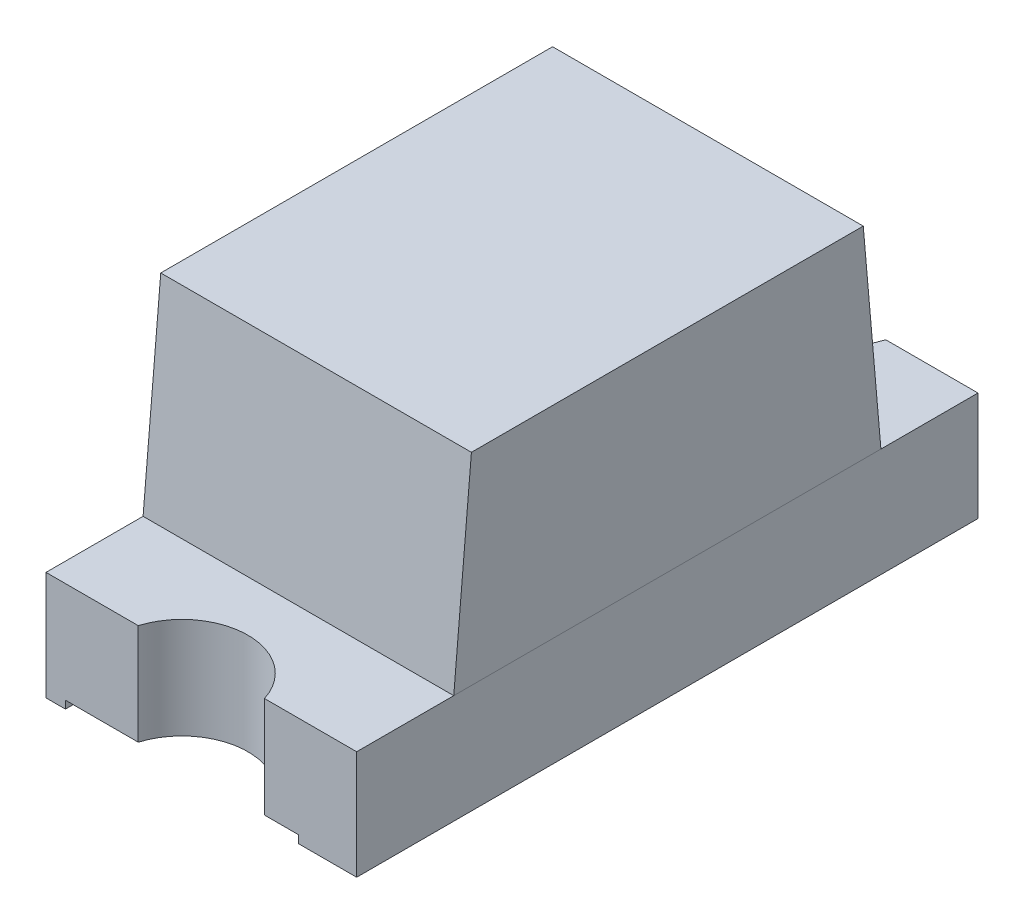
ISO-10303-21;
HEADER;
FILE_DESCRIPTION(('STEP AP214'),'2;1');
FILE_NAME('part.step','',(''),(''),'','','');
FILE_SCHEMA(('AUTOMOTIVE_DESIGN { 1 0 10303 214 1 1 1 1 }'));
ENDSEC;
DATA;
#1=APPLICATION_CONTEXT('core data for automotive mechanical design processes');
#2=APPLICATION_PROTOCOL_DEFINITION('international standard','automotive_design',2000,#1);
#3=PRODUCT_CONTEXT('',#1,'mechanical');
#4=PRODUCT('Part','Part','',(#3));
#5=PRODUCT_RELATED_PRODUCT_CATEGORY('part','',(#4));
#6=PRODUCT_DEFINITION_FORMATION('','',#4);
#7=PRODUCT_DEFINITION_CONTEXT('part definition',#1,'design');
#8=PRODUCT_DEFINITION('design','',#6,#7);
#9=PRODUCT_DEFINITION_SHAPE('','',#8);
#10=(LENGTH_UNIT() NAMED_UNIT(*) SI_UNIT(.MILLI.,.METRE.));
#11=(NAMED_UNIT(*) PLANE_ANGLE_UNIT() SI_UNIT($,.RADIAN.));
#12=(NAMED_UNIT(*) SI_UNIT($,.STERADIAN.) SOLID_ANGLE_UNIT());
#13=UNCERTAINTY_MEASURE_WITH_UNIT(LENGTH_MEASURE(1.E-05),#10,'distance_accuracy_value','');
#14=(GEOMETRIC_REPRESENTATION_CONTEXT(3) GLOBAL_UNCERTAINTY_ASSIGNED_CONTEXT((#13)) GLOBAL_UNIT_ASSIGNED_CONTEXT((#10,
#11,#12)) REPRESENTATION_CONTEXT('',''));
#15=CARTESIAN_POINT('',(0.,0.,0.));
#16=DIRECTION('',(0.,0.,1.));
#17=DIRECTION('',(1.,0.,0.));
#18=AXIS2_PLACEMENT_3D('',#15,#16,#17);
#19=CARTESIAN_POINT('',(0.,0.38,0.));
#20=DIRECTION('',(0.,-1.,0.));
#21=DIRECTION('',(0.,0.,-1.));
#22=AXIS2_PLACEMENT_3D('',#19,#20,#21);
#23=CYLINDRICAL_SURFACE('',#22,0.1);
#24=CARTESIAN_POINT('',(0.,0.38,0.));
#25=DIRECTION('',(0.,1.,0.));
#26=DIRECTION('',(0.,0.,1.));
#27=AXIS2_PLACEMENT_3D('',#24,#25,#26);
#28=CIRCLE('',#27,0.1);
#29=CARTESIAN_POINT('',(0.,0.38,0.1));
#30=VERTEX_POINT('',#29);
#31=EDGE_CURVE('E13',#30,#30,#28,.T.);
#32=ORIENTED_EDGE('',*,*,#31,.F.);
#33=EDGE_LOOP('',(#32));
#34=FACE_BOUND('',#33,.T.);
#35=CARTESIAN_POINT('',(0.,0.28,0.));
#36=DIRECTION('',(0.,1.,0.));
#37=DIRECTION('',(0.,0.,1.));
#38=AXIS2_PLACEMENT_3D('',#35,#36,#37);
#39=CIRCLE('',#38,0.1);
#40=CARTESIAN_POINT('',(0.,0.28,0.1));
#41=VERTEX_POINT('',#40);
#42=EDGE_CURVE('E53',#41,#41,#39,.T.);
#43=ORIENTED_EDGE('',*,*,#42,.T.);
#44=EDGE_LOOP('',(#43));
#45=FACE_BOUND('',#44,.T.);
#46=ADVANCED_FACE('F50',(#34,#45),#23,.T.);
#47=CARTESIAN_POINT('',(0.,0.38,0.));
#48=DIRECTION('',(0.,1.,0.));
#49=DIRECTION('',(0.,0.,1.));
#50=AXIS2_PLACEMENT_3D('',#47,#48,#49);
#51=PLANE('',#50);
#52=ORIENTED_EDGE('',*,*,#31,.T.);
#53=EDGE_LOOP('',(#52));
#54=FACE_BOUND('',#53,.T.);
#55=ADVANCED_FACE('F65',(#54),#51,.T.);
#56=CARTESIAN_POINT('',(0.,0.28,0.));
#57=DIRECTION('',(0.,1.,0.));
#58=DIRECTION('',(0.,0.,1.));
#59=AXIS2_PLACEMENT_3D('',#56,#57,#58);
#60=PLANE('',#59);
#61=ORIENTED_EDGE('',*,*,#42,.F.);
#62=EDGE_LOOP('',(#61));
#63=FACE_BOUND('',#62,.T.);
#64=ADVANCED_FACE('F63',(#63),#60,.F.);
#65=CLOSED_SHELL('',(#46,#55,#64));
#66=MANIFOLD_SOLID_BREP('B2',#65);
#67=CARTESIAN_POINT('',(0.,0.28,0.));
#68=DIRECTION('',(0.,1.,0.));
#69=DIRECTION('',(0.,0.,1.));
#70=AXIS2_PLACEMENT_3D('',#67,#68,#69);
#71=PLANE('',#70);
#72=DIRECTION('',(-1.,0.,0.));
#73=VECTOR('',#72,1.);
#74=CARTESIAN_POINT('',(0.4,0.28,-0.8));
#75=LINE('',#74,#73);
#76=CARTESIAN_POINT('',(-0.162480768092719,0.28,-0.8));
#77=VERTEX_POINT('',#76);
#78=CARTESIAN_POINT('',(-0.4,0.28,-0.8));
#79=VERTEX_POINT('',#78);
#80=EDGE_CURVE('E356',#77,#79,#75,.T.);
#81=ORIENTED_EDGE('',*,*,#80,.T.);
#82=DIRECTION('',(0.,0.,1.));
#83=VECTOR('',#82,1.);
#84=CARTESIAN_POINT('',(-0.4,0.28,0.));
#85=LINE('',#84,#83);
#86=CARTESIAN_POINT('',(-0.4,0.28,0.8));
#87=VERTEX_POINT('',#86);
#88=EDGE_CURVE('E302',#79,#87,#85,.T.);
#89=ORIENTED_EDGE('',*,*,#88,.T.);
#90=DIRECTION('',(1.,0.,0.));
#91=VECTOR('',#90,1.);
#92=CARTESIAN_POINT('',(0.4,0.28,0.8));
#93=LINE('',#92,#91);
#94=CARTESIAN_POINT('',(-0.162480768092719,0.28,0.8));
#95=VERTEX_POINT('',#94);
#96=EDGE_CURVE('E306',#87,#95,#93,.T.);
#97=ORIENTED_EDGE('',*,*,#96,.T.);
#98=CARTESIAN_POINT('',(0.,0.28,0.85));
#99=DIRECTION('',(0.,1.,0.));
#100=DIRECTION('',(0.,0.,1.));
#101=AXIS2_PLACEMENT_3D('',#98,#99,#100);
#102=CIRCLE('',#101,0.17);
#103=CARTESIAN_POINT('',(0.162480768092719,0.28,0.8));
#104=VERTEX_POINT('',#103);
#105=EDGE_CURVE('E295',#104,#95,#102,.T.);
#106=ORIENTED_EDGE('',*,*,#105,.F.);
#107=DIRECTION('',(1.,0.,0.));
#108=VECTOR('',#107,1.);
#109=CARTESIAN_POINT('',(0.4,0.28,0.8));
#110=LINE('',#109,#108);
#111=CARTESIAN_POINT('',(0.4,0.28,0.8));
#112=VERTEX_POINT('',#111);
#113=EDGE_CURVE('E298',#104,#112,#110,.T.);
#114=ORIENTED_EDGE('',*,*,#113,.T.);
#115=DIRECTION('',(0.,0.,-1.));
#116=VECTOR('',#115,1.);
#117=CARTESIAN_POINT('',(0.4,0.28,0.));
#118=LINE('',#117,#116);
#119=CARTESIAN_POINT('',(0.4,0.28,-0.8));
#120=VERTEX_POINT('',#119);
#121=EDGE_CURVE('E285',#112,#120,#118,.T.);
#122=ORIENTED_EDGE('',*,*,#121,.T.);
#123=DIRECTION('',(-1.,0.,0.));
#124=VECTOR('',#123,1.);
#125=CARTESIAN_POINT('',(0.4,0.28,-0.8));
#126=LINE('',#125,#124);
#127=CARTESIAN_POINT('',(0.162480768092719,0.28,-0.8));
#128=VERTEX_POINT('',#127);
#129=EDGE_CURVE('E275',#120,#128,#126,.T.);
#130=ORIENTED_EDGE('',*,*,#129,.T.);
#131=CARTESIAN_POINT('',(0.,0.28,-0.85));
#132=DIRECTION('',(0.,1.,0.));
#133=DIRECTION('',(0.,0.,1.));
#134=AXIS2_PLACEMENT_3D('',#131,#132,#133);
#135=CIRCLE('',#134,0.17);
#136=CARTESIAN_POINT('',(0.,0.28,-0.68));
#137=VERTEX_POINT('',#136);
#138=EDGE_CURVE('E260',#137,#128,#135,.T.);
#139=ORIENTED_EDGE('',*,*,#138,.F.);
#140=CARTESIAN_POINT('',(0.,0.28,-0.85));
#141=DIRECTION('',(0.,1.,0.));
#142=DIRECTION('',(0.,0.,1.));
#143=AXIS2_PLACEMENT_3D('',#140,#141,#142);
#144=CIRCLE('',#143,0.17);
#145=EDGE_CURVE('E324',#77,#137,#144,.T.);
#146=ORIENTED_EDGE('',*,*,#145,.F.);
#147=EDGE_LOOP('',(#81,#89,#97,#106,#114,#122,#130,#139,#146));
#148=FACE_BOUND('',#147,.T.);
#149=ADVANCED_FACE('F100',(#148),#71,.T.);
#150=CARTESIAN_POINT('',(-0.35,0.02,0.4));
#151=DIRECTION('',(0.,0.,-1.));
#152=DIRECTION('',(-1.,0.,0.));
#153=AXIS2_PLACEMENT_3D('',#150,#151,#152);
#154=PLANE('',#153);
#155=DIRECTION('',(1.,0.,0.));
#156=VECTOR('',#155,1.);
#157=CARTESIAN_POINT('',(-0.35,0.,0.4));
#158=LINE('',#157,#156);
#159=CARTESIAN_POINT('',(-0.35,0.,0.4));
#160=VERTEX_POINT('',#159);
#161=CARTESIAN_POINT('',(0.35,0.,0.4));
#162=VERTEX_POINT('',#161);
#163=EDGE_CURVE('E393',#160,#162,#158,.T.);
#164=ORIENTED_EDGE('',*,*,#163,.T.);
#165=DIRECTION('',(0.,-1.,0.));
#166=VECTOR('',#165,1.);
#167=CARTESIAN_POINT('',(0.35,0.02,0.4));
#168=LINE('',#167,#166);
#169=CARTESIAN_POINT('',(0.35,0.02,0.4));
#170=VERTEX_POINT('',#169);
#171=EDGE_CURVE('E108',#170,#162,#168,.T.);
#172=ORIENTED_EDGE('',*,*,#171,.F.);
#173=DIRECTION('',(1.,0.,0.));
#174=VECTOR('',#173,1.);
#175=CARTESIAN_POINT('',(-0.35,0.02,0.4));
#176=LINE('',#175,#174);
#177=CARTESIAN_POINT('',(-0.35,0.02,0.4));
#178=VERTEX_POINT('',#177);
#179=EDGE_CURVE('E120',#178,#170,#176,.T.);
#180=ORIENTED_EDGE('',*,*,#179,.F.);
#181=DIRECTION('',(0.,-1.,0.));
#182=VECTOR('',#181,1.);
#183=CARTESIAN_POINT('',(-0.35,0.02,0.4));
#184=LINE('',#183,#182);
#185=EDGE_CURVE('E48',#178,#160,#184,.T.);
#186=ORIENTED_EDGE('',*,*,#185,.T.);
#187=EDGE_LOOP('',(#164,#172,#180,#186));
#188=FACE_BOUND('',#187,.T.);
#189=ADVANCED_FACE('F458',(#188),#154,.F.);
#190=CARTESIAN_POINT('',(0.35,0.02,0.7));
#191=DIRECTION('',(1.,0.,0.));
#192=DIRECTION('',(0.,0.,-1.));
#193=AXIS2_PLACEMENT_3D('',#190,#191,#192);
#194=PLANE('',#193);
#195=DIRECTION('',(0.,0.,1.));
#196=VECTOR('',#195,1.);
#197=CARTESIAN_POINT('',(0.35,0.,0.7));
#198=LINE('',#197,#196);
#199=CARTESIAN_POINT('',(0.35,0.,0.7));
#200=VERTEX_POINT('',#199);
#201=EDGE_CURVE('E390',#162,#200,#198,.T.);
#202=ORIENTED_EDGE('',*,*,#201,.T.);
#203=DIRECTION('',(0.,-1.,0.));
#204=VECTOR('',#203,1.);
#205=CARTESIAN_POINT('',(0.35,0.02,0.7));
#206=LINE('',#205,#204);
#207=CARTESIAN_POINT('',(0.35,0.02,0.7));
#208=VERTEX_POINT('',#207);
#209=EDGE_CURVE('E450',#208,#200,#206,.T.);
#210=ORIENTED_EDGE('',*,*,#209,.F.);
#211=DIRECTION('',(0.,0.,1.));
#212=VECTOR('',#211,1.);
#213=CARTESIAN_POINT('',(0.35,0.02,0.7));
#214=LINE('',#213,#212);
#215=EDGE_CURVE('E115',#170,#208,#214,.T.);
#216=ORIENTED_EDGE('',*,*,#215,.F.);
#217=ORIENTED_EDGE('',*,*,#171,.T.);
#218=EDGE_LOOP('',(#202,#210,#216,#217));
#219=FACE_BOUND('',#218,.T.);
#220=ADVANCED_FACE('F455',(#219),#194,.F.);
#221=CARTESIAN_POINT('',(0.35,0.02,-0.7));
#222=DIRECTION('',(1.,0.,0.));
#223=DIRECTION('',(0.,0.,-1.));
#224=AXIS2_PLACEMENT_3D('',#221,#222,#223);
#225=PLANE('',#224);
#226=DIRECTION('',(0.,0.,1.));
#227=VECTOR('',#226,1.);
#228=CARTESIAN_POINT('',(0.35,0.,-0.7));
#229=LINE('',#228,#227);
#230=CARTESIAN_POINT('',(0.35,0.,-0.7));
#231=VERTEX_POINT('',#230);
#232=CARTESIAN_POINT('',(0.35,0.,-0.4));
#233=VERTEX_POINT('',#232);
#234=EDGE_CURVE('E378',#231,#233,#229,.T.);
#235=ORIENTED_EDGE('',*,*,#234,.T.);
#236=DIRECTION('',(0.,-1.,0.));
#237=VECTOR('',#236,1.);
#238=CARTESIAN_POINT('',(0.35,0.02,-0.4));
#239=LINE('',#238,#237);
#240=CARTESIAN_POINT('',(0.35,0.02,-0.4));
#241=VERTEX_POINT('',#240);
#242=EDGE_CURVE('E438',#241,#233,#239,.T.);
#243=ORIENTED_EDGE('',*,*,#242,.F.);
#244=DIRECTION('',(0.,0.,1.));
#245=VECTOR('',#244,1.);
#246=CARTESIAN_POINT('',(0.35,0.02,-0.7));
#247=LINE('',#246,#245);
#248=CARTESIAN_POINT('',(0.35,0.02,-0.7));
#249=VERTEX_POINT('',#248);
#250=EDGE_CURVE('E403',#249,#241,#247,.T.);
#251=ORIENTED_EDGE('',*,*,#250,.F.);
#252=DIRECTION('',(0.,-1.,0.));
#253=VECTOR('',#252,1.);
#254=CARTESIAN_POINT('',(0.35,0.02,-0.7));
#255=LINE('',#254,#253);
#256=EDGE_CURVE('E441',#249,#231,#255,.T.);
#257=ORIENTED_EDGE('',*,*,#256,.T.);
#258=EDGE_LOOP('',(#235,#243,#251,#257));
#259=FACE_BOUND('',#258,.T.);
#260=ADVANCED_FACE('F514',(#259),#225,.F.);
#261=CARTESIAN_POINT('',(0.35,0.02,-0.4));
#262=DIRECTION('',(0.,0.,1.));
#263=DIRECTION('',(1.,0.,0.));
#264=AXIS2_PLACEMENT_3D('',#261,#262,#263);
#265=PLANE('',#264);
#266=DIRECTION('',(-1.,0.,0.));
#267=VECTOR('',#266,1.);
#268=CARTESIAN_POINT('',(0.35,0.,-0.4));
#269=LINE('',#268,#267);
#270=CARTESIAN_POINT('',(0.2,0.,-0.4));
#271=VERTEX_POINT('',#270);
#272=EDGE_CURVE('E375',#233,#271,#269,.T.);
#273=ORIENTED_EDGE('',*,*,#272,.T.);
#274=DIRECTION('',(0.,-1.,0.));
#275=VECTOR('',#274,1.);
#276=CARTESIAN_POINT('',(0.2,0.02,-0.4));
#277=LINE('',#276,#275);
#278=CARTESIAN_POINT('',(0.2,0.02,-0.4));
#279=VERTEX_POINT('',#278);
#280=EDGE_CURVE('E435',#279,#271,#277,.T.);
#281=ORIENTED_EDGE('',*,*,#280,.F.);
#282=DIRECTION('',(-1.,0.,0.));
#283=VECTOR('',#282,1.);
#284=CARTESIAN_POINT('',(0.35,0.02,-0.4));
#285=LINE('',#284,#283);
#286=EDGE_CURVE('E405',#241,#279,#285,.T.);
#287=ORIENTED_EDGE('',*,*,#286,.F.);
#288=ORIENTED_EDGE('',*,*,#242,.T.);
#289=EDGE_LOOP('',(#273,#281,#287,#288));
#290=FACE_BOUND('',#289,.T.);
#291=ADVANCED_FACE('F509',(#290),#265,.F.);
#292=CARTESIAN_POINT('',(0.2,0.02,-0.4));
#293=DIRECTION('',(1.,0.,0.));
#294=DIRECTION('',(0.,0.,-1.));
#295=AXIS2_PLACEMENT_3D('',#292,#293,#294);
#296=PLANE('',#295);
#297=DIRECTION('',(0.,0.,1.));
#298=VECTOR('',#297,1.);
#299=CARTESIAN_POINT('',(0.2,0.,-0.4));
#300=LINE('',#299,#298);
#301=CARTESIAN_POINT('',(0.2,0.,-0.131366411611003));
#302=VERTEX_POINT('',#301);
#303=EDGE_CURVE('E372',#271,#302,#300,.T.);
#304=ORIENTED_EDGE('',*,*,#303,.T.);
#305=DIRECTION('',(0.,-1.,0.));
#306=VECTOR('',#305,1.);
#307=CARTESIAN_POINT('',(0.2,0.02,-0.131366411611003));
#308=LINE('',#307,#306);
#309=CARTESIAN_POINT('',(0.2,0.02,-0.131366411611003));
#310=VERTEX_POINT('',#309);
#311=EDGE_CURVE('E432',#310,#302,#308,.T.);
#312=ORIENTED_EDGE('',*,*,#311,.F.);
#313=DIRECTION('',(0.,0.,1.));
#314=VECTOR('',#313,1.);
#315=CARTESIAN_POINT('',(0.2,0.02,-0.4));
#316=LINE('',#315,#314);
#317=EDGE_CURVE('E407',#279,#310,#316,.T.);
#318=ORIENTED_EDGE('',*,*,#317,.F.);
#319=ORIENTED_EDGE('',*,*,#280,.T.);
#320=EDGE_LOOP('',(#304,#312,#318,#319));
#321=FACE_BOUND('',#320,.T.);
#322=ADVANCED_FACE('F506',(#321),#296,.F.);
#323=CARTESIAN_POINT('',(-0.2,0.02,-0.131366411611003));
#324=DIRECTION('',(0.,0.,1.));
#325=DIRECTION('',(1.,0.,0.));
#326=AXIS2_PLACEMENT_3D('',#323,#324,#325);
#327=PLANE('',#326);
#328=DIRECTION('',(-1.,0.,0.));
#329=VECTOR('',#328,1.);
#330=CARTESIAN_POINT('',(-0.2,0.,-0.131366411611003));
#331=LINE('',#330,#329);
#332=CARTESIAN_POINT('',(-0.2,0.,-0.131366411611003));
#333=VERTEX_POINT('',#332);
#334=EDGE_CURVE('E369',#302,#333,#331,.T.);
#335=ORIENTED_EDGE('',*,*,#334,.T.);
#336=DIRECTION('',(0.,-1.,0.));
#337=VECTOR('',#336,1.);
#338=CARTESIAN_POINT('',(-0.2,0.02,-0.131366411611003));
#339=LINE('',#338,#337);
#340=CARTESIAN_POINT('',(-0.2,0.02,-0.131366411611003));
#341=VERTEX_POINT('',#340);
#342=EDGE_CURVE('E429',#341,#333,#339,.T.);
#343=ORIENTED_EDGE('',*,*,#342,.F.);
#344=DIRECTION('',(-1.,0.,0.));
#345=VECTOR('',#344,1.);
#346=CARTESIAN_POINT('',(-0.2,0.02,-0.131366411611003));
#347=LINE('',#346,#345);
#348=EDGE_CURVE('E409',#310,#341,#347,.T.);
#349=ORIENTED_EDGE('',*,*,#348,.F.);
#350=ORIENTED_EDGE('',*,*,#311,.T.);
#351=EDGE_LOOP('',(#335,#343,#349,#350));
#352=FACE_BOUND('',#351,.T.);
#353=ADVANCED_FACE('F501',(#352),#327,.F.);
#354=CARTESIAN_POINT('',(-0.2,0.02,-0.4));
#355=DIRECTION('',(-1.,0.,0.));
#356=DIRECTION('',(0.,0.,1.));
#357=AXIS2_PLACEMENT_3D('',#354,#355,#356);
#358=PLANE('',#357);
#359=DIRECTION('',(0.,0.,-1.));
#360=VECTOR('',#359,1.);
#361=CARTESIAN_POINT('',(-0.2,0.,-0.4));
#362=LINE('',#361,#360);
#363=CARTESIAN_POINT('',(-0.2,0.,-0.4));
#364=VERTEX_POINT('',#363);
#365=EDGE_CURVE('E366',#333,#364,#362,.T.);
#366=ORIENTED_EDGE('',*,*,#365,.T.);
#367=DIRECTION('',(0.,-1.,0.));
#368=VECTOR('',#367,1.);
#369=CARTESIAN_POINT('',(-0.2,0.02,-0.4));
#370=LINE('',#369,#368);
#371=CARTESIAN_POINT('',(-0.2,0.02,-0.4));
#372=VERTEX_POINT('',#371);
#373=EDGE_CURVE('E426',#372,#364,#370,.T.);
#374=ORIENTED_EDGE('',*,*,#373,.F.);
#375=DIRECTION('',(0.,0.,-1.));
#376=VECTOR('',#375,1.);
#377=CARTESIAN_POINT('',(-0.2,0.02,-0.4));
#378=LINE('',#377,#376);
#379=EDGE_CURVE('E411',#341,#372,#378,.T.);
#380=ORIENTED_EDGE('',*,*,#379,.F.);
#381=ORIENTED_EDGE('',*,*,#342,.T.);
#382=EDGE_LOOP('',(#366,#374,#380,#381));
#383=FACE_BOUND('',#382,.T.);
#384=ADVANCED_FACE('F498',(#383),#358,.F.);
#385=CARTESIAN_POINT('',(-0.35,0.02,-0.4));
#386=DIRECTION('',(0.,0.,1.));
#387=DIRECTION('',(1.,0.,0.));
#388=AXIS2_PLACEMENT_3D('',#385,#386,#387);
#389=PLANE('',#388);
#390=DIRECTION('',(-1.,0.,0.));
#391=VECTOR('',#390,1.);
#392=CARTESIAN_POINT('',(-0.35,0.,-0.4));
#393=LINE('',#392,#391);
#394=CARTESIAN_POINT('',(-0.35,0.,-0.4));
#395=VERTEX_POINT('',#394);
#396=EDGE_CURVE('E363',#364,#395,#393,.T.);
#397=ORIENTED_EDGE('',*,*,#396,.T.);
#398=DIRECTION('',(0.,-1.,0.));
#399=VECTOR('',#398,1.);
#400=CARTESIAN_POINT('',(-0.35,0.02,-0.4));
#401=LINE('',#400,#399);
#402=CARTESIAN_POINT('',(-0.35,0.02,-0.4));
#403=VERTEX_POINT('',#402);
#404=EDGE_CURVE('E423',#403,#395,#401,.T.);
#405=ORIENTED_EDGE('',*,*,#404,.F.);
#406=DIRECTION('',(-1.,0.,0.));
#407=VECTOR('',#406,1.);
#408=CARTESIAN_POINT('',(-0.35,0.02,-0.4));
#409=LINE('',#408,#407);
#410=EDGE_CURVE('E413',#372,#403,#409,.T.);
#411=ORIENTED_EDGE('',*,*,#410,.F.);
#412=ORIENTED_EDGE('',*,*,#373,.T.);
#413=EDGE_LOOP('',(#397,#405,#411,#412));
#414=FACE_BOUND('',#413,.T.);
#415=ADVANCED_FACE('F493',(#414),#389,.F.);
#416=CARTESIAN_POINT('',(-0.35,0.02,-0.7));
#417=DIRECTION('',(-1.,0.,0.));
#418=DIRECTION('',(0.,0.,1.));
#419=AXIS2_PLACEMENT_3D('',#416,#417,#418);
#420=PLANE('',#419);
#421=DIRECTION('',(0.,0.,-1.));
#422=VECTOR('',#421,1.);
#423=CARTESIAN_POINT('',(-0.35,0.,-0.7));
#424=LINE('',#423,#422);
#425=CARTESIAN_POINT('',(-0.35,0.,-0.7));
#426=VERTEX_POINT('',#425);
#427=EDGE_CURVE('E360',#395,#426,#424,.T.);
#428=ORIENTED_EDGE('',*,*,#427,.T.);
#429=DIRECTION('',(0.,-1.,0.));
#430=VECTOR('',#429,1.);
#431=CARTESIAN_POINT('',(-0.35,0.02,-0.7));
#432=LINE('',#431,#430);
#433=CARTESIAN_POINT('',(-0.35,0.02,-0.7));
#434=VERTEX_POINT('',#433);
#435=EDGE_CURVE('E420',#434,#426,#432,.T.);
#436=ORIENTED_EDGE('',*,*,#435,.F.);
#437=DIRECTION('',(0.,0.,-1.));
#438=VECTOR('',#437,1.);
#439=CARTESIAN_POINT('',(-0.35,0.02,-0.7));
#440=LINE('',#439,#438);
#441=EDGE_CURVE('E415',#403,#434,#440,.T.);
#442=ORIENTED_EDGE('',*,*,#441,.F.);
#443=ORIENTED_EDGE('',*,*,#404,.T.);
#444=EDGE_LOOP('',(#428,#436,#442,#443));
#445=FACE_BOUND('',#444,.T.);
#446=ADVANCED_FACE('F490',(#445),#420,.F.);
#447=CARTESIAN_POINT('',(-0.35,0.02,0.8));
#448=DIRECTION('',(-1.,0.,0.));
#449=DIRECTION('',(0.,0.,1.));
#450=AXIS2_PLACEMENT_3D('',#447,#448,#449);
#451=PLANE('',#450);
#452=DIRECTION('',(0.,0.,-1.));
#453=VECTOR('',#452,1.);
#454=CARTESIAN_POINT('',(-0.35,0.,0.8));
#455=LINE('',#454,#453);
#456=CARTESIAN_POINT('',(-0.35,0.,0.8));
#457=VERTEX_POINT('',#456);
#458=EDGE_CURVE('E396',#457,#160,#455,.T.);
#459=ORIENTED_EDGE('',*,*,#458,.T.);
#460=ORIENTED_EDGE('',*,*,#185,.F.);
#461=DIRECTION('',(0.,0.,-1.));
#462=VECTOR('',#461,1.);
#463=CARTESIAN_POINT('',(-0.35,0.02,0.8));
#464=LINE('',#463,#462);
#465=CARTESIAN_POINT('',(-0.35,0.02,0.8));
#466=VERTEX_POINT('',#465);
#467=EDGE_CURVE('E444',#466,#178,#464,.T.);
#468=ORIENTED_EDGE('',*,*,#467,.F.);
#469=DIRECTION('',(0.,-1.,0.));
#470=VECTOR('',#469,1.);
#471=CARTESIAN_POINT('',(-0.35,0.02,0.8));
#472=LINE('',#471,#470);
#473=EDGE_CURVE('E327',#466,#457,#472,.T.);
#474=ORIENTED_EDGE('',*,*,#473,.T.);
#475=EDGE_LOOP('',(#459,#460,#468,#474));
#476=FACE_BOUND('',#475,.T.);
#477=ADVANCED_FACE('F465',(#476),#451,.F.);
#478=CARTESIAN_POINT('',(0.,-0.342279937413158,0.85));
#479=DIRECTION('',(0.,1.,0.));
#480=DIRECTION('',(0.,0.,1.));
#481=AXIS2_PLACEMENT_3D('',#478,#479,#480);
#482=CYLINDRICAL_SURFACE('',#481,0.17);
#483=CARTESIAN_POINT('',(0.,0.02,0.85));
#484=DIRECTION('',(0.,1.,0.));
#485=DIRECTION('',(0.,0.,-1.));
#486=AXIS2_PLACEMENT_3D('',#483,#484,#485);
#487=CIRCLE('',#486,0.17);
#488=CARTESIAN_POINT('',(0.162480768092719,0.02,0.8));
#489=VERTEX_POINT('',#488);
#490=CARTESIAN_POINT('',(-0.162480768092719,0.02,0.8));
#491=VERTEX_POINT('',#490);
#492=EDGE_CURVE('E270',#489,#491,#487,.T.);
#493=ORIENTED_EDGE('',*,*,#492,.F.);
#494=DIRECTION('',(0.,1.,0.));
#495=VECTOR('',#494,1.);
#496=CARTESIAN_POINT('',(0.162480768092719,-0.342279937413158,0.8));
#497=LINE('',#496,#495);
#498=EDGE_CURVE('E315',#489,#104,#497,.T.);
#499=ORIENTED_EDGE('',*,*,#498,.T.);
#500=ORIENTED_EDGE('',*,*,#105,.T.);
#501=DIRECTION('',(0.,1.,0.));
#502=VECTOR('',#501,1.);
#503=CARTESIAN_POINT('',(-0.162480768092719,-0.342279937413158,0.8));
#504=LINE('',#503,#502);
#505=EDGE_CURVE('E280',#95,#491,#504,.F.);
#506=ORIENTED_EDGE('',*,*,#505,.T.);
#507=EDGE_LOOP('',(#493,#499,#500,#506));
#508=FACE_BOUND('',#507,.T.);
#509=ADVANCED_FACE('F474',(#508),#482,.F.);
#510=CARTESIAN_POINT('',(0.25,0.02,0.8));
#511=DIRECTION('',(0.707106781186548,0.,0.707106781186548));
#512=DIRECTION('',(0.707106781186548,0.,-0.707106781186548));
#513=AXIS2_PLACEMENT_3D('',#510,#511,#512);
#514=PLANE('',#513);
#515=DIRECTION('',(-0.707106781186547,0.,0.707106781186548));
#516=VECTOR('',#515,1.);
#517=CARTESIAN_POINT('',(0.25,0.,0.8));
#518=LINE('',#517,#516);
#519=CARTESIAN_POINT('',(0.25,0.,0.8));
#520=VERTEX_POINT('',#519);
#521=EDGE_CURVE('E387',#200,#520,#518,.T.);
#522=ORIENTED_EDGE('',*,*,#521,.T.);
#523=DIRECTION('',(0.,-1.,0.));
#524=VECTOR('',#523,1.);
#525=CARTESIAN_POINT('',(0.25,0.02,0.8));
#526=LINE('',#525,#524);
#527=CARTESIAN_POINT('',(0.25,0.02,0.8));
#528=VERTEX_POINT('',#527);
#529=EDGE_CURVE('E340',#528,#520,#526,.T.);
#530=ORIENTED_EDGE('',*,*,#529,.F.);
#531=DIRECTION('',(-0.707106781186547,0.,0.707106781186548));
#532=VECTOR('',#531,1.);
#533=CARTESIAN_POINT('',(0.25,0.02,0.8));
#534=LINE('',#533,#532);
#535=EDGE_CURVE('E448',#208,#528,#534,.T.);
#536=ORIENTED_EDGE('',*,*,#535,.F.);
#537=ORIENTED_EDGE('',*,*,#209,.T.);
#538=EDGE_LOOP('',(#522,#530,#536,#537));
#539=FACE_BOUND('',#538,.T.);
#540=ADVANCED_FACE('F562',(#539),#514,.F.);
#541=CARTESIAN_POINT('',(0.,0.02,0.85));
#542=DIRECTION('',(0.,-1.,0.));
#543=DIRECTION('',(0.,0.,-1.));
#544=AXIS2_PLACEMENT_3D('',#541,#542,#543);
#545=PLANE('',#544);
#546=ORIENTED_EDGE('',*,*,#492,.T.);
#547=DIRECTION('',(-1.,0.,0.));
#548=VECTOR('',#547,1.);
#549=CARTESIAN_POINT('',(-0.14142135623731,0.02,0.8));
#550=LINE('',#549,#548);
#551=EDGE_CURVE('E310',#491,#466,#550,.T.);
#552=ORIENTED_EDGE('',*,*,#551,.T.);
#553=ORIENTED_EDGE('',*,*,#467,.T.);
#554=ORIENTED_EDGE('',*,*,#179,.T.);
#555=ORIENTED_EDGE('',*,*,#215,.T.);
#556=ORIENTED_EDGE('',*,*,#535,.T.);
#557=DIRECTION('',(-1.,0.,0.));
#558=VECTOR('',#557,1.);
#559=CARTESIAN_POINT('',(0.14142135623731,0.02,0.8));
#560=LINE('',#559,#558);
#561=EDGE_CURVE('E288',#528,#489,#560,.T.);
#562=ORIENTED_EDGE('',*,*,#561,.T.);
#563=EDGE_LOOP('',(#546,#552,#553,#554,#555,#556,#562));
#564=FACE_BOUND('',#563,.T.);
#565=ADVANCED_FACE('F471',(#564),#545,.T.);
#566=CARTESIAN_POINT('',(0.25,0.02,-0.8));
#567=DIRECTION('',(0.707106781186548,0.,-0.707106781186548));
#568=DIRECTION('',(-0.707106781186548,0.,-0.707106781186548));
#569=AXIS2_PLACEMENT_3D('',#566,#567,#568);
#570=PLANE('',#569);
#571=DIRECTION('',(0.707106781186547,0.,0.707106781186548));
#572=VECTOR('',#571,1.);
#573=CARTESIAN_POINT('',(0.25,0.,-0.8));
#574=LINE('',#573,#572);
#575=CARTESIAN_POINT('',(0.25,0.,-0.8));
#576=VERTEX_POINT('',#575);
#577=EDGE_CURVE('E381',#576,#231,#574,.T.);
#578=ORIENTED_EDGE('',*,*,#577,.T.);
#579=ORIENTED_EDGE('',*,*,#256,.F.);
#580=DIRECTION('',(0.707106781186547,0.,0.707106781186548));
#581=VECTOR('',#580,1.);
#582=CARTESIAN_POINT('',(0.25,0.02,-0.8));
#583=LINE('',#582,#581);
#584=CARTESIAN_POINT('',(0.25,0.02,-0.8));
#585=VERTEX_POINT('',#584);
#586=EDGE_CURVE('E305',#585,#249,#583,.T.);
#587=ORIENTED_EDGE('',*,*,#586,.F.);
#588=DIRECTION('',(0.,-1.,0.));
#589=VECTOR('',#588,1.);
#590=CARTESIAN_POINT('',(0.25,0.02,-0.8));
#591=LINE('',#590,#589);
#592=EDGE_CURVE('E290',#585,#576,#591,.T.);
#593=ORIENTED_EDGE('',*,*,#592,.T.);
#594=EDGE_LOOP('',(#578,#579,#587,#593));
#595=FACE_BOUND('',#594,.T.);
#596=ADVANCED_FACE('F518',(#595),#570,.F.);
#597=CARTESIAN_POINT('',(0.,-0.342279937413158,-0.85));
#598=DIRECTION('',(0.,1.,0.));
#599=DIRECTION('',(0.,0.,1.));
#600=AXIS2_PLACEMENT_3D('',#597,#598,#599);
#601=CYLINDRICAL_SURFACE('',#600,0.17);
#602=CARTESIAN_POINT('',(0.,0.02,-0.85));
#603=DIRECTION('',(0.,1.,0.));
#604=DIRECTION('',(0.,0.,-1.));
#605=AXIS2_PLACEMENT_3D('',#602,#603,#604);
#606=CIRCLE('',#605,0.17);
#607=CARTESIAN_POINT('',(0.,0.02,-0.68));
#608=VERTEX_POINT('',#607);
#609=CARTESIAN_POINT('',(0.162480768092719,0.02,-0.8));
#610=VERTEX_POINT('',#609);
#611=EDGE_CURVE('E318',#608,#610,#606,.T.);
#612=ORIENTED_EDGE('',*,*,#611,.F.);
#613=DIRECTION('',(0.,1.,0.));
#614=VECTOR('',#613,1.);
#615=CARTESIAN_POINT('',(0.,-0.342279937413158,-0.68));
#616=LINE('',#615,#614);
#617=EDGE_CURVE('E266',#608,#137,#616,.T.);
#618=ORIENTED_EDGE('',*,*,#617,.T.);
#619=ORIENTED_EDGE('',*,*,#138,.T.);
#620=DIRECTION('',(0.,1.,0.));
#621=VECTOR('',#620,1.);
#622=CARTESIAN_POINT('',(0.162480768092719,-0.342279937413158,-0.8));
#623=LINE('',#622,#621);
#624=EDGE_CURVE('E264',#128,#610,#623,.F.);
#625=ORIENTED_EDGE('',*,*,#624,.T.);
#626=EDGE_LOOP('',(#612,#618,#619,#625));
#627=FACE_BOUND('',#626,.T.);
#628=ADVANCED_FACE('F263',(#627),#601,.F.);
#629=CARTESIAN_POINT('',(0.,-0.342279937413158,-0.85));
#630=DIRECTION('',(0.,1.,0.));
#631=DIRECTION('',(0.,0.,1.));
#632=AXIS2_PLACEMENT_3D('',#629,#630,#631);
#633=CYLINDRICAL_SURFACE('',#632,0.17);
#634=ORIENTED_EDGE('',*,*,#617,.F.);
#635=CARTESIAN_POINT('',(0.,0.02,-0.85));
#636=DIRECTION('',(0.,1.,0.));
#637=DIRECTION('',(0.,0.,-1.));
#638=AXIS2_PLACEMENT_3D('',#635,#636,#637);
#639=CIRCLE('',#638,0.17);
#640=CARTESIAN_POINT('',(-0.162480768092719,0.02,-0.8));
#641=VERTEX_POINT('',#640);
#642=EDGE_CURVE('E297',#641,#608,#639,.T.);
#643=ORIENTED_EDGE('',*,*,#642,.F.);
#644=DIRECTION('',(0.,1.,0.));
#645=VECTOR('',#644,1.);
#646=CARTESIAN_POINT('',(-0.162480768092719,-0.342279937413158,-0.8));
#647=LINE('',#646,#645);
#648=EDGE_CURVE('E279',#641,#77,#647,.T.);
#649=ORIENTED_EDGE('',*,*,#648,.T.);
#650=ORIENTED_EDGE('',*,*,#145,.T.);
#651=EDGE_LOOP('',(#634,#643,#649,#650));
#652=FACE_BOUND('',#651,.T.);
#653=ADVANCED_FACE('F523',(#652),#633,.F.);
#654=CARTESIAN_POINT('',(-0.25,0.02,-0.8));
#655=DIRECTION('',(-0.707106781186548,0.,-0.707106781186548));
#656=DIRECTION('',(-0.707106781186548,0.,0.707106781186548));
#657=AXIS2_PLACEMENT_3D('',#654,#655,#656);
#658=PLANE('',#657);
#659=DIRECTION('',(0.707106781186547,0.,-0.707106781186548));
#660=VECTOR('',#659,1.);
#661=CARTESIAN_POINT('',(-0.25,0.,-0.8));
#662=LINE('',#661,#660);
#663=CARTESIAN_POINT('',(-0.25,0.,-0.8));
#664=VERTEX_POINT('',#663);
#665=EDGE_CURVE('E357',#426,#664,#662,.T.);
#666=ORIENTED_EDGE('',*,*,#665,.T.);
#667=DIRECTION('',(0.,-1.,0.));
#668=VECTOR('',#667,1.);
#669=CARTESIAN_POINT('',(-0.25,0.02,-0.8));
#670=LINE('',#669,#668);
#671=CARTESIAN_POINT('',(-0.25,0.02,-0.8));
#672=VERTEX_POINT('',#671);
#673=EDGE_CURVE('E349',#672,#664,#670,.T.);
#674=ORIENTED_EDGE('',*,*,#673,.F.);
#675=DIRECTION('',(0.707106781186547,0.,-0.707106781186548));
#676=VECTOR('',#675,1.);
#677=CARTESIAN_POINT('',(-0.25,0.02,-0.8));
#678=LINE('',#677,#676);
#679=EDGE_CURVE('E417',#434,#672,#678,.T.);
#680=ORIENTED_EDGE('',*,*,#679,.F.);
#681=ORIENTED_EDGE('',*,*,#435,.T.);
#682=EDGE_LOOP('',(#666,#674,#680,#681));
#683=FACE_BOUND('',#682,.T.);
#684=ADVANCED_FACE('F485',(#683),#658,.F.);
#685=CARTESIAN_POINT('',(0.,0.02,-0.85));
#686=DIRECTION('',(0.,-1.,0.));
#687=DIRECTION('',(0.,0.,-1.));
#688=AXIS2_PLACEMENT_3D('',#685,#686,#687);
#689=PLANE('',#688);
#690=ORIENTED_EDGE('',*,*,#611,.T.);
#691=DIRECTION('',(1.,0.,0.));
#692=VECTOR('',#691,1.);
#693=CARTESIAN_POINT('',(0.14142135623731,0.02,-0.8));
#694=LINE('',#693,#692);
#695=EDGE_CURVE('E278',#610,#585,#694,.T.);
#696=ORIENTED_EDGE('',*,*,#695,.T.);
#697=ORIENTED_EDGE('',*,*,#586,.T.);
#698=ORIENTED_EDGE('',*,*,#250,.T.);
#699=ORIENTED_EDGE('',*,*,#286,.T.);
#700=ORIENTED_EDGE('',*,*,#317,.T.);
#701=ORIENTED_EDGE('',*,*,#348,.T.);
#702=ORIENTED_EDGE('',*,*,#379,.T.);
#703=ORIENTED_EDGE('',*,*,#410,.T.);
#704=ORIENTED_EDGE('',*,*,#441,.T.);
#705=ORIENTED_EDGE('',*,*,#679,.T.);
#706=DIRECTION('',(1.,0.,0.));
#707=VECTOR('',#706,1.);
#708=CARTESIAN_POINT('',(-0.14142135623731,0.02,-0.8));
#709=LINE('',#708,#707);
#710=EDGE_CURVE('E300',#672,#641,#709,.T.);
#711=ORIENTED_EDGE('',*,*,#710,.T.);
#712=ORIENTED_EDGE('',*,*,#642,.T.);
#713=EDGE_LOOP('',(#690,#696,#697,#698,#699,#700,#701,#702,#703,#704,#705,#711,#712));
#714=FACE_BOUND('',#713,.T.);
#715=ADVANCED_FACE('F521',(#714),#689,.T.);
#716=CARTESIAN_POINT('',(0.4,0.,0.8));
#717=DIRECTION('',(0.,0.,-1.));
#718=DIRECTION('',(-1.,0.,0.));
#719=AXIS2_PLACEMENT_3D('',#716,#717,#718);
#720=PLANE('',#719);
#721=DIRECTION('',(-1.,0.,0.));
#722=VECTOR('',#721,1.);
#723=CARTESIAN_POINT('',(0.4,0.,0.8));
#724=LINE('',#723,#722);
#725=CARTESIAN_POINT('',(-0.4,0.,0.8));
#726=VERTEX_POINT('',#725);
#727=EDGE_CURVE('E325',#457,#726,#724,.T.);
#728=ORIENTED_EDGE('',*,*,#727,.F.);
#729=ORIENTED_EDGE('',*,*,#473,.F.);
#730=ORIENTED_EDGE('',*,*,#551,.F.);
#731=ORIENTED_EDGE('',*,*,#505,.F.);
#732=ORIENTED_EDGE('',*,*,#96,.F.);
#733=DIRECTION('',(0.,-1.,0.));
#734=VECTOR('',#733,1.);
#735=CARTESIAN_POINT('',(-0.4,0.,0.8));
#736=LINE('',#735,#734);
#737=EDGE_CURVE('E309',#87,#726,#736,.T.);
#738=ORIENTED_EDGE('',*,*,#737,.T.);
#739=EDGE_LOOP('',(#728,#729,#730,#731,#732,#738));
#740=FACE_BOUND('',#739,.T.);
#741=ADVANCED_FACE('F469',(#740),#720,.F.);
#742=CARTESIAN_POINT('',(0.4,0.,-0.8));
#743=DIRECTION('',(0.,0.,1.));
#744=DIRECTION('',(1.,0.,0.));
#745=AXIS2_PLACEMENT_3D('',#742,#743,#744);
#746=PLANE('',#745);
#747=DIRECTION('',(-1.,0.,0.));
#748=VECTOR('',#747,1.);
#749=CARTESIAN_POINT('',(0.4,0.,-0.8));
#750=LINE('',#749,#748);
#751=CARTESIAN_POINT('',(0.4,0.,-0.8));
#752=VERTEX_POINT('',#751);
#753=EDGE_CURVE('E334',#752,#576,#750,.T.);
#754=ORIENTED_EDGE('',*,*,#753,.T.);
#755=ORIENTED_EDGE('',*,*,#592,.F.);
#756=ORIENTED_EDGE('',*,*,#695,.F.);
#757=ORIENTED_EDGE('',*,*,#624,.F.);
#758=ORIENTED_EDGE('',*,*,#129,.F.);
#759=DIRECTION('',(0.,1.,0.));
#760=VECTOR('',#759,1.);
#761=CARTESIAN_POINT('',(0.4,0.,-0.8));
#762=LINE('',#761,#760);
#763=EDGE_CURVE('E286',#752,#120,#762,.T.);
#764=ORIENTED_EDGE('',*,*,#763,.F.);
#765=EDGE_LOOP('',(#754,#755,#756,#757,#758,#764));
#766=FACE_BOUND('',#765,.T.);
#767=ADVANCED_FACE('F273',(#766),#746,.F.);
#768=CARTESIAN_POINT('',(0.4,0.,-0.8));
#769=DIRECTION('',(0.,1.,0.));
#770=DIRECTION('',(0.,0.,1.));
#771=AXIS2_PLACEMENT_3D('',#768,#769,#770);
#772=PLANE('',#771);
#773=DIRECTION('',(-1.,0.,0.));
#774=VECTOR('',#773,1.);
#775=CARTESIAN_POINT('',(0.4,0.,-0.8));
#776=LINE('',#775,#774);
#777=CARTESIAN_POINT('',(-0.4,0.,-0.8));
#778=VERTEX_POINT('',#777);
#779=EDGE_CURVE('E351',#664,#778,#776,.T.);
#780=ORIENTED_EDGE('',*,*,#779,.F.);
#781=ORIENTED_EDGE('',*,*,#665,.F.);
#782=ORIENTED_EDGE('',*,*,#427,.F.);
#783=ORIENTED_EDGE('',*,*,#396,.F.);
#784=ORIENTED_EDGE('',*,*,#365,.F.);
#785=ORIENTED_EDGE('',*,*,#334,.F.);
#786=ORIENTED_EDGE('',*,*,#303,.F.);
#787=ORIENTED_EDGE('',*,*,#272,.F.);
#788=ORIENTED_EDGE('',*,*,#234,.F.);
#789=ORIENTED_EDGE('',*,*,#577,.F.);
#790=ORIENTED_EDGE('',*,*,#753,.F.);
#791=DIRECTION('',(0.,0.,-1.));
#792=VECTOR('',#791,1.);
#793=CARTESIAN_POINT('',(0.4,0.,-0.8));
#794=LINE('',#793,#792);
#795=CARTESIAN_POINT('',(0.4,0.,0.8));
#796=VERTEX_POINT('',#795);
#797=EDGE_CURVE('E384',#796,#752,#794,.T.);
#798=ORIENTED_EDGE('',*,*,#797,.F.);
#799=DIRECTION('',(-1.,0.,0.));
#800=VECTOR('',#799,1.);
#801=CARTESIAN_POINT('',(0.4,0.,0.8));
#802=LINE('',#801,#800);
#803=EDGE_CURVE('E342',#796,#520,#802,.T.);
#804=ORIENTED_EDGE('',*,*,#803,.T.);
#805=ORIENTED_EDGE('',*,*,#521,.F.);
#806=ORIENTED_EDGE('',*,*,#201,.F.);
#807=ORIENTED_EDGE('',*,*,#163,.F.);
#808=ORIENTED_EDGE('',*,*,#458,.F.);
#809=ORIENTED_EDGE('',*,*,#727,.T.);
#810=DIRECTION('',(0.,0.,-1.));
#811=VECTOR('',#810,1.);
#812=CARTESIAN_POINT('',(-0.4,0.,-0.8));
#813=LINE('',#812,#811);
#814=EDGE_CURVE('E399',#726,#778,#813,.T.);
#815=ORIENTED_EDGE('',*,*,#814,.T.);
#816=EDGE_LOOP('',(#780,#781,#782,#783,#784,#785,#786,#787,#788,#789,#790,#798,#804,#805,#806,
#807,#808,#809,#815));
#817=FACE_BOUND('',#816,.T.);
#818=ADVANCED_FACE('F463',(#817),#772,.F.);
#819=CARTESIAN_POINT('',(0.4,0.,0.8));
#820=DIRECTION('',(0.,0.,-1.));
#821=DIRECTION('',(-1.,0.,0.));
#822=AXIS2_PLACEMENT_3D('',#819,#820,#821);
#823=PLANE('',#822);
#824=ORIENTED_EDGE('',*,*,#561,.F.);
#825=ORIENTED_EDGE('',*,*,#529,.T.);
#826=ORIENTED_EDGE('',*,*,#803,.F.);
#827=DIRECTION('',(0.,-1.,0.));
#828=VECTOR('',#827,1.);
#829=CARTESIAN_POINT('',(0.4,0.,0.8));
#830=LINE('',#829,#828);
#831=EDGE_CURVE('E301',#112,#796,#830,.T.);
#832=ORIENTED_EDGE('',*,*,#831,.F.);
#833=ORIENTED_EDGE('',*,*,#113,.F.);
#834=ORIENTED_EDGE('',*,*,#498,.F.);
#835=EDGE_LOOP('',(#824,#825,#826,#832,#833,#834));
#836=FACE_BOUND('',#835,.T.);
#837=ADVANCED_FACE('F548',(#836),#823,.F.);
#838=CARTESIAN_POINT('',(0.4,0.,0.));
#839=DIRECTION('',(1.,0.,0.));
#840=DIRECTION('',(0.,0.,-1.));
#841=AXIS2_PLACEMENT_3D('',#838,#839,#840);
#842=PLANE('',#841);
#843=ORIENTED_EDGE('',*,*,#121,.F.);
#844=ORIENTED_EDGE('',*,*,#831,.T.);
#845=ORIENTED_EDGE('',*,*,#797,.T.);
#846=ORIENTED_EDGE('',*,*,#763,.T.);
#847=EDGE_LOOP('',(#843,#844,#845,#846));
#848=FACE_BOUND('',#847,.T.);
#849=ADVANCED_FACE('F546',(#848),#842,.T.);
#850=CARTESIAN_POINT('',(0.4,0.,-0.8));
#851=DIRECTION('',(0.,0.,1.));
#852=DIRECTION('',(1.,0.,0.));
#853=AXIS2_PLACEMENT_3D('',#850,#851,#852);
#854=PLANE('',#853);
#855=ORIENTED_EDGE('',*,*,#710,.F.);
#856=ORIENTED_EDGE('',*,*,#673,.T.);
#857=ORIENTED_EDGE('',*,*,#779,.T.);
#858=DIRECTION('',(0.,1.,0.));
#859=VECTOR('',#858,1.);
#860=CARTESIAN_POINT('',(-0.4,0.,-0.8));
#861=LINE('',#860,#859);
#862=EDGE_CURVE('E353',#778,#79,#861,.T.);
#863=ORIENTED_EDGE('',*,*,#862,.T.);
#864=ORIENTED_EDGE('',*,*,#80,.F.);
#865=ORIENTED_EDGE('',*,*,#648,.F.);
#866=EDGE_LOOP('',(#855,#856,#857,#863,#864,#865));
#867=FACE_BOUND('',#866,.T.);
#868=ADVANCED_FACE('F481',(#867),#854,.F.);
#869=CARTESIAN_POINT('',(-0.4,0.,0.));
#870=DIRECTION('',(1.,0.,0.));
#871=DIRECTION('',(0.,0.,-1.));
#872=AXIS2_PLACEMENT_3D('',#869,#870,#871);
#873=PLANE('',#872);
#874=ORIENTED_EDGE('',*,*,#88,.F.);
#875=ORIENTED_EDGE('',*,*,#862,.F.);
#876=ORIENTED_EDGE('',*,*,#814,.F.);
#877=ORIENTED_EDGE('',*,*,#737,.F.);
#878=EDGE_LOOP('',(#874,#875,#876,#877));
#879=FACE_BOUND('',#878,.T.);
#880=ADVANCED_FACE('F102',(#879),#873,.F.);
#881=CLOSED_SHELL('',(#149,#189,#220,#260,#291,#322,#353,#384,#415,#446,#477,#509,#540,#565,
#596,#628,#653,#684,#715,#741,#767,#818,#837,#849,#868,#880));
#882=MANIFOLD_SOLID_BREP('B8',#881);
#883=CARTESIAN_POINT('',(0.,0.28,0.));
#884=DIRECTION('',(0.,1.,0.));
#885=DIRECTION('',(0.,0.,1.));
#886=AXIS2_PLACEMENT_3D('',#883,#884,#885);
#887=PLANE('',#886);
#888=DIRECTION('',(0.,0.,1.));
#889=VECTOR('',#888,1.);
#890=CARTESIAN_POINT('',(0.4,0.28,0.));
#891=LINE('',#890,#889);
#892=CARTESIAN_POINT('',(0.4,0.28,-0.55));
#893=VERTEX_POINT('',#892);
#894=CARTESIAN_POINT('',(0.4,0.28,0.55));
#895=VERTEX_POINT('',#894);
#896=EDGE_CURVE('E753',#893,#895,#891,.T.);
#897=ORIENTED_EDGE('',*,*,#896,.T.);
#898=DIRECTION('',(-1.,0.,0.));
#899=VECTOR('',#898,1.);
#900=CARTESIAN_POINT('',(0.,0.28,0.55));
#901=LINE('',#900,#899);
#902=CARTESIAN_POINT('',(-0.4,0.28,0.55));
#903=VERTEX_POINT('',#902);
#904=EDGE_CURVE('E758',#895,#903,#901,.T.);
#905=ORIENTED_EDGE('',*,*,#904,.T.);
#906=DIRECTION('',(0.,0.,1.));
#907=VECTOR('',#906,1.);
#908=CARTESIAN_POINT('',(-0.4,0.28,0.));
#909=LINE('',#908,#907);
#910=CARTESIAN_POINT('',(-0.4,0.28,-0.55));
#911=VERTEX_POINT('',#910);
#912=EDGE_CURVE('E820',#911,#903,#909,.T.);
#913=ORIENTED_EDGE('',*,*,#912,.F.);
#914=DIRECTION('',(1.,0.,0.));
#915=VECTOR('',#914,1.);
#916=CARTESIAN_POINT('',(0.,0.28,-0.55));
#917=LINE('',#916,#915);
#918=EDGE_CURVE('E98',#911,#893,#917,.T.);
#919=ORIENTED_EDGE('',*,*,#918,.T.);
#920=EDGE_LOOP('',(#897,#905,#913,#919));
#921=FACE_BOUND('',#920,.T.);
#922=ADVANCED_FACE('F750',(#921),#887,.F.);
#923=CARTESIAN_POINT('',(0.4,0.,0.));
#924=DIRECTION('',(1.,0.,0.));
#925=DIRECTION('',(0.,0.,-1.));
#926=AXIS2_PLACEMENT_3D('',#923,#924,#925);
#927=PLANE('',#926);
#928=ORIENTED_EDGE('',*,*,#896,.F.);
#929=DIRECTION('',(0.,0.996194698091746,0.0871557427476543));
#930=VECTOR('',#929,1.);
#931=CARTESIAN_POINT('',(0.4,0.28,-0.55));
#932=LINE('',#931,#930);
#933=CARTESIAN_POINT('',(0.4,0.8,-0.504505894966522));
#934=VERTEX_POINT('',#933);
#935=EDGE_CURVE('E806',#893,#934,#932,.T.);
#936=ORIENTED_EDGE('',*,*,#935,.T.);
#937=DIRECTION('',(0.,0.,1.));
#938=VECTOR('',#937,1.);
#939=CARTESIAN_POINT('',(0.4,0.8,0.504505894966522));
#940=LINE('',#939,#938);
#941=CARTESIAN_POINT('',(0.4,0.8,0.504505894966522));
#942=VERTEX_POINT('',#941);
#943=EDGE_CURVE('E793',#934,#942,#940,.T.);
#944=ORIENTED_EDGE('',*,*,#943,.T.);
#945=DIRECTION('',(0.,-0.996194698091746,0.0871557427476543));
#946=VECTOR('',#945,1.);
#947=CARTESIAN_POINT('',(0.4,0.28,0.55));
#948=LINE('',#947,#946);
#949=EDGE_CURVE('E805',#942,#895,#948,.T.);
#950=ORIENTED_EDGE('',*,*,#949,.T.);
#951=EDGE_LOOP('',(#928,#936,#944,#950));
#952=FACE_BOUND('',#951,.T.);
#953=ADVANCED_FACE('F804',(#952),#927,.T.);
#954=CARTESIAN_POINT('',(0.4,0.8,0.504505894966522));
#955=DIRECTION('',(0.,-1.,0.));
#956=DIRECTION('',(0.,0.,-1.));
#957=AXIS2_PLACEMENT_3D('',#954,#955,#956);
#958=PLANE('',#957);
#959=DIRECTION('',(0.,0.,1.));
#960=VECTOR('',#959,1.);
#961=CARTESIAN_POINT('',(-0.4,0.8,0.504505894966522));
#962=LINE('',#961,#960);
#963=CARTESIAN_POINT('',(-0.4,0.8,-0.504505894966522));
#964=VERTEX_POINT('',#963);
#965=CARTESIAN_POINT('',(-0.4,0.8,0.504505894966522));
#966=VERTEX_POINT('',#965);
#967=EDGE_CURVE('E795',#964,#966,#962,.T.);
#968=ORIENTED_EDGE('',*,*,#967,.T.);
#969=DIRECTION('',(-1.,0.,0.));
#970=VECTOR('',#969,1.);
#971=CARTESIAN_POINT('',(0.4,0.8,0.504505894966522));
#972=LINE('',#971,#970);
#973=EDGE_CURVE('E789',#942,#966,#972,.T.);
#974=ORIENTED_EDGE('',*,*,#973,.F.);
#975=ORIENTED_EDGE('',*,*,#943,.F.);
#976=DIRECTION('',(-1.,0.,0.));
#977=VECTOR('',#976,1.);
#978=CARTESIAN_POINT('',(0.4,0.8,-0.504505894966522));
#979=LINE('',#978,#977);
#980=EDGE_CURVE('E816',#934,#964,#979,.T.);
#981=ORIENTED_EDGE('',*,*,#980,.T.);
#982=EDGE_LOOP('',(#968,#974,#975,#981));
#983=FACE_BOUND('',#982,.T.);
#984=ADVANCED_FACE('F791',(#983),#958,.F.);
#985=CARTESIAN_POINT('',(-0.4,0.,0.));
#986=DIRECTION('',(1.,0.,0.));
#987=DIRECTION('',(0.,0.,-1.));
#988=AXIS2_PLACEMENT_3D('',#985,#986,#987);
#989=PLANE('',#988);
#990=DIRECTION('',(0.,0.996194698091746,0.0871557427476543));
#991=VECTOR('',#990,1.);
#992=CARTESIAN_POINT('',(-0.4,0.28,-0.55));
#993=LINE('',#992,#991);
#994=EDGE_CURVE('E818',#911,#964,#993,.T.);
#995=ORIENTED_EDGE('',*,*,#994,.F.);
#996=ORIENTED_EDGE('',*,*,#912,.T.);
#997=DIRECTION('',(0.,-0.996194698091746,0.0871557427476543));
#998=VECTOR('',#997,1.);
#999=CARTESIAN_POINT('',(-0.4,0.28,0.55));
#1000=LINE('',#999,#998);
#1001=EDGE_CURVE('E807',#966,#903,#1000,.T.);
#1002=ORIENTED_EDGE('',*,*,#1001,.F.);
#1003=ORIENTED_EDGE('',*,*,#967,.F.);
#1004=EDGE_LOOP('',(#995,#996,#1002,#1003));
#1005=FACE_BOUND('',#1004,.T.);
#1006=ADVANCED_FACE('F824',(#1005),#989,.F.);
#1007=CARTESIAN_POINT('',(0.4,0.28,-0.55));
#1008=DIRECTION('',(0.,-0.0871557427476543,0.996194698091746));
#1009=DIRECTION('',(0.,-0.996194698091746,-0.0871557427476543));
#1010=AXIS2_PLACEMENT_3D('',#1007,#1008,#1009);
#1011=PLANE('',#1010);
#1012=ORIENTED_EDGE('',*,*,#994,.T.);
#1013=ORIENTED_EDGE('',*,*,#980,.F.);
#1014=ORIENTED_EDGE('',*,*,#935,.F.);
#1015=ORIENTED_EDGE('',*,*,#918,.F.);
#1016=EDGE_LOOP('',(#1012,#1013,#1014,#1015));
#1017=FACE_BOUND('',#1016,.T.);
#1018=ADVANCED_FACE('F823',(#1017),#1011,.F.);
#1019=CARTESIAN_POINT('',(0.4,0.28,0.55));
#1020=DIRECTION('',(0.,-0.0871557427476543,-0.996194698091746));
#1021=DIRECTION('',(0.,0.996194698091746,-0.0871557427476543));
#1022=AXIS2_PLACEMENT_3D('',#1019,#1020,#1021);
#1023=PLANE('',#1022);
#1024=ORIENTED_EDGE('',*,*,#1001,.T.);
#1025=ORIENTED_EDGE('',*,*,#904,.F.);
#1026=ORIENTED_EDGE('',*,*,#949,.F.);
#1027=ORIENTED_EDGE('',*,*,#973,.T.);
#1028=EDGE_LOOP('',(#1024,#1025,#1026,#1027));
#1029=FACE_BOUND('',#1028,.T.);
#1030=ADVANCED_FACE('F809',(#1029),#1023,.F.);
#1031=CLOSED_SHELL('',(#922,#953,#984,#1006,#1018,#1030));
#1032=MANIFOLD_SOLID_BREP('B42',#1031);
#1033=ADVANCED_BREP_SHAPE_REPRESENTATION('',(#18,#66,#882,#1032),#14);
#1034=SHAPE_DEFINITION_REPRESENTATION(#9,#1033);
ENDSEC;
END-ISO-10303-21;
